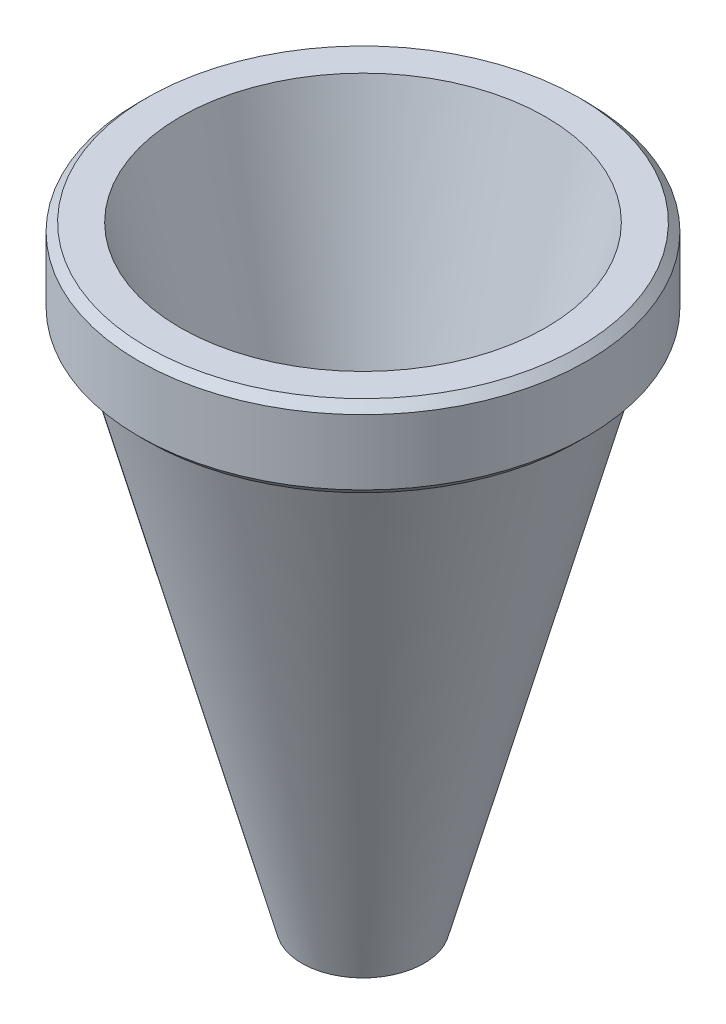
ISO-10303-21;
HEADER;
FILE_DESCRIPTION(('STEP AP214'),'2;1');
FILE_NAME('part.step','',(''),(''),'','','');
FILE_SCHEMA(('AUTOMOTIVE_DESIGN { 1 0 10303 214 1 1 1 1 }'));
ENDSEC;
DATA;
#1=APPLICATION_CONTEXT('core data for automotive mechanical design processes');
#2=APPLICATION_PROTOCOL_DEFINITION('international standard','automotive_design',2000,#1);
#3=PRODUCT_CONTEXT('',#1,'mechanical');
#4=PRODUCT('Part','Part','',(#3));
#5=PRODUCT_RELATED_PRODUCT_CATEGORY('part','',(#4));
#6=PRODUCT_DEFINITION_FORMATION('','',#4);
#7=PRODUCT_DEFINITION_CONTEXT('part definition',#1,'design');
#8=PRODUCT_DEFINITION('design','',#6,#7);
#9=PRODUCT_DEFINITION_SHAPE('','',#8);
#10=(LENGTH_UNIT() NAMED_UNIT(*) SI_UNIT(.MILLI.,.METRE.));
#11=(NAMED_UNIT(*) PLANE_ANGLE_UNIT() SI_UNIT($,.RADIAN.));
#12=(NAMED_UNIT(*) SI_UNIT($,.STERADIAN.) SOLID_ANGLE_UNIT());
#13=UNCERTAINTY_MEASURE_WITH_UNIT(LENGTH_MEASURE(1.E-05),#10,'distance_accuracy_value','');
#14=(GEOMETRIC_REPRESENTATION_CONTEXT(3) GLOBAL_UNCERTAINTY_ASSIGNED_CONTEXT((#13)) GLOBAL_UNIT_ASSIGNED_CONTEXT((#10,
#11,#12)) REPRESENTATION_CONTEXT('',''));
#15=CARTESIAN_POINT('',(0.,0.,0.));
#16=DIRECTION('',(0.,0.,1.));
#17=DIRECTION('',(1.,0.,0.));
#18=AXIS2_PLACEMENT_3D('',#15,#16,#17);
#19=CARTESIAN_POINT('',(0.,2.,0.));
#20=DIRECTION('',(0.,1.,0.));
#21=DIRECTION('',(1.,0.,0.));
#22=AXIS2_PLACEMENT_3D('',#19,#20,#21);
#23=PLANE('',#22);
#24=CARTESIAN_POINT('',(0.,2.,0.));
#25=DIRECTION('',(0.,-1.,0.));
#26=DIRECTION('',(1.,0.,0.));
#27=AXIS2_PLACEMENT_3D('',#24,#25,#26);
#28=CIRCLE('',#27,1.);
#29=CARTESIAN_POINT('',(-1.,2.,0.));
#30=VERTEX_POINT('',#29);
#31=EDGE_CURVE('E28',#30,#30,#28,.T.);
#32=ORIENTED_EDGE('',*,*,#31,.F.);
#33=EDGE_LOOP('',(#32));
#34=FACE_BOUND('',#33,.T.);
#35=ADVANCED_FACE('F17',(#34),#23,.T.);
#36=CARTESIAN_POINT('',(0.,8.5,0.));
#37=DIRECTION('',(0.,1.,0.));
#38=DIRECTION('',(1.,0.,0.));
#39=AXIS2_PLACEMENT_3D('',#36,#37,#38);
#40=CONICAL_SURFACE('',#39,2.741669750802,0.261799387799149);
#41=ORIENTED_EDGE('',*,*,#31,.T.);
#42=DIRECTION('',(-0.258819045102521,0.965925826289068,0.));
#43=VECTOR('',#42,1.);
#44=CARTESIAN_POINT('',(-2.741669750802,8.5,0.));
#45=LINE('',#44,#43);
#46=CARTESIAN_POINT('',(-4.483339501605,15.,0.));
#47=VERTEX_POINT('',#46);
#48=EDGE_CURVE('E11',#30,#47,#45,.T.);
#49=ORIENTED_EDGE('',*,*,#48,.T.);
#50=CARTESIAN_POINT('',(0.,15.,0.));
#51=DIRECTION('',(0.,1.,0.));
#52=DIRECTION('',(1.,0.,0.));
#53=AXIS2_PLACEMENT_3D('',#50,#51,#52);
#54=CIRCLE('',#53,4.483339501605);
#55=EDGE_CURVE('E87',#47,#47,#54,.T.);
#56=ORIENTED_EDGE('',*,*,#55,.T.);
#57=ORIENTED_EDGE('',*,*,#48,.F.);
#58=EDGE_LOOP('',(#41,#49,#56,#57));
#59=FACE_BOUND('',#58,.T.);
#60=ADVANCED_FACE('F157',(#59),#40,.F.);
#61=CARTESIAN_POINT('',(0.,15.,0.));
#62=DIRECTION('',(0.,1.,0.));
#63=DIRECTION('',(1.,0.,0.));
#64=AXIS2_PLACEMENT_3D('',#61,#62,#63);
#65=PLANE('',#64);
#66=ORIENTED_EDGE('',*,*,#55,.F.);
#67=EDGE_LOOP('',(#66));
#68=FACE_BOUND('',#67,.T.);
#69=CARTESIAN_POINT('',(0.,15.00000058203,0.));
#70=DIRECTION('',(0.,1.,0.));
#71=DIRECTION('',(1.,0.,0.));
#72=AXIS2_PLACEMENT_3D('',#69,#70,#71);
#73=CIRCLE('',#72,5.29999985448);
#74=CARTESIAN_POINT('',(0.,15.0000005820339,5.29999985448393));
#75=VERTEX_POINT('',#74);
#76=EDGE_CURVE('E83',#75,#75,#73,.T.);
#77=ORIENTED_EDGE('',*,*,#76,.T.);
#78=EDGE_LOOP('',(#77));
#79=FACE_BOUND('',#78,.T.);
#80=ADVANCED_FACE('F84',(#68,#79),#65,.T.);
#81=CARTESIAN_POINT('',(0.,14.90000010319,0.));
#82=DIRECTION('',(0.,-1.,0.));
#83=DIRECTION('',(0.,0.,-1.));
#84=AXIS2_PLACEMENT_3D('',#81,#82,#83);
#85=CONICAL_SURFACE('',#84,5.400000341564,0.785398204577968);
#86=CARTESIAN_POINT('',(0.,14.79999923756,0.));
#87=DIRECTION('',(0.,1.,0.));
#88=DIRECTION('',(1.,0.,0.));
#89=AXIS2_PLACEMENT_3D('',#86,#87,#88);
#90=CIRCLE('',#89,5.5);
#91=CARTESIAN_POINT('',(-5.5,14.79999923756,0.));
#92=VERTEX_POINT('',#91);
#93=CARTESIAN_POINT('',(0.,14.7999998452751,5.50000060771505));
#94=VERTEX_POINT('',#93);
#95=EDGE_CURVE('E102',#92,#94,#90,.T.);
#96=ORIENTED_EDGE('',*,*,#95,.T.);
#97=DIRECTION('',(0.,0.707106752067522,-0.707106810305572));
#98=VECTOR('',#97,1.);
#99=CARTESIAN_POINT('',(0.,14.90000010319,5.400000341564));
#100=LINE('',#99,#98);
#101=EDGE_CURVE('E88',#94,#75,#100,.T.);
#102=ORIENTED_EDGE('',*,*,#101,.T.);
#103=ORIENTED_EDGE('',*,*,#76,.F.);
#104=ORIENTED_EDGE('',*,*,#101,.F.);
#105=CARTESIAN_POINT('',(0.,14.79999923756,0.));
#106=DIRECTION('',(0.,1.,0.));
#107=DIRECTION('',(1.,0.,0.));
#108=AXIS2_PLACEMENT_3D('',#105,#106,#107);
#109=CIRCLE('',#108,5.5);
#110=EDGE_CURVE('E52',#94,#92,#109,.T.);
#111=ORIENTED_EDGE('',*,*,#110,.T.);
#112=EDGE_LOOP('',(#96,#102,#103,#104,#111));
#113=FACE_BOUND('',#112,.T.);
#114=ADVANCED_FACE('F119',(#113),#85,.T.);
#115=CARTESIAN_POINT('',(0.,-0.75,0.));
#116=DIRECTION('',(0.,1.,0.));
#117=DIRECTION('',(1.,0.,0.));
#118=AXIS2_PLACEMENT_3D('',#115,#116,#117);
#119=CYLINDRICAL_SURFACE('',#118,5.5);
#120=ORIENTED_EDGE('',*,*,#95,.F.);
#121=DIRECTION('',(0.,-1.,0.));
#122=VECTOR('',#121,1.);
#123=CARTESIAN_POINT('',(-5.5,-0.75,0.));
#124=LINE('',#123,#122);
#125=CARTESIAN_POINT('',(-5.5,13.20000061936,0.));
#126=VERTEX_POINT('',#125);
#127=EDGE_CURVE('E99',#92,#126,#124,.T.);
#128=ORIENTED_EDGE('',*,*,#127,.T.);
#129=CARTESIAN_POINT('',(0.,13.20000061936,0.));
#130=DIRECTION('',(0.,1.,0.));
#131=DIRECTION('',(1.,0.,0.));
#132=AXIS2_PLACEMENT_3D('',#129,#130,#131);
#133=CIRCLE('',#132,5.5);
#134=CARTESIAN_POINT('',(0.,13.2000000005091,5.5000006188508));
#135=VERTEX_POINT('',#134);
#136=EDGE_CURVE('E109',#126,#135,#133,.T.);
#137=ORIENTED_EDGE('',*,*,#136,.T.);
#138=CARTESIAN_POINT('',(0.,13.20000061936,0.));
#139=DIRECTION('',(0.,1.,0.));
#140=DIRECTION('',(1.,0.,0.));
#141=AXIS2_PLACEMENT_3D('',#138,#139,#140);
#142=CIRCLE('',#141,5.5);
#143=EDGE_CURVE('E105',#135,#126,#142,.T.);
#144=ORIENTED_EDGE('',*,*,#143,.T.);
#145=ORIENTED_EDGE('',*,*,#127,.F.);
#146=ORIENTED_EDGE('',*,*,#110,.F.);
#147=EDGE_LOOP('',(#120,#128,#137,#144,#145,#146));
#148=FACE_BOUND('',#147,.T.);
#149=ADVANCED_FACE('F121',(#148),#119,.T.);
#150=CARTESIAN_POINT('',(0.,13.09999978553,0.));
#151=DIRECTION('',(0.,1.,0.));
#152=DIRECTION('',(0.,0.,-1.));
#153=AXIS2_PLACEMENT_3D('',#150,#151,#152);
#154=CONICAL_SURFACE('',#153,5.400000392629,0.785398219610664);
#155=ORIENTED_EDGE('',*,*,#136,.F.);
#156=ORIENTED_EDGE('',*,*,#143,.F.);
#157=DIRECTION('',(0.,-0.707106741437801,-0.707106820935292));
#158=VECTOR('',#157,1.);
#159=CARTESIAN_POINT('',(0.,13.09999978553,5.400000392629));
#160=LINE('',#159,#158);
#161=CARTESIAN_POINT('',(0.,12.9999994065833,5.30000000243966));
#162=VERTEX_POINT('',#161);
#163=EDGE_CURVE('E65',#135,#162,#160,.T.);
#164=ORIENTED_EDGE('',*,*,#163,.T.);
#165=CARTESIAN_POINT('',(0.,12.99999940658,0.));
#166=DIRECTION('',(0.,1.,0.));
#167=DIRECTION('',(1.,0.,0.));
#168=AXIS2_PLACEMENT_3D('',#165,#166,#167);
#169=CIRCLE('',#168,5.300000002443);
#170=EDGE_CURVE('E127',#162,#162,#169,.T.);
#171=ORIENTED_EDGE('',*,*,#170,.T.);
#172=ORIENTED_EDGE('',*,*,#163,.F.);
#173=EDGE_LOOP('',(#155,#156,#164,#171,#172));
#174=FACE_BOUND('',#173,.T.);
#175=ADVANCED_FACE('F138',(#174),#154,.T.);
#176=CARTESIAN_POINT('',(0.,13.,0.));
#177=DIRECTION('',(0.,1.,0.));
#178=DIRECTION('',(1.,0.,0.));
#179=AXIS2_PLACEMENT_3D('',#176,#177,#178);
#180=PLANE('',#179);
#181=CARTESIAN_POINT('',(0.,13.,0.));
#182=DIRECTION('',(0.,-1.,0.));
#183=DIRECTION('',(1.,0.,0.));
#184=AXIS2_PLACEMENT_3D('',#181,#182,#183);
#185=CIRCLE('',#184,4.983339501605);
#186=CARTESIAN_POINT('',(-4.983339501605,13.,0.));
#187=VERTEX_POINT('',#186);
#188=EDGE_CURVE('E110',#187,#187,#185,.T.);
#189=ORIENTED_EDGE('',*,*,#188,.F.);
#190=EDGE_LOOP('',(#189));
#191=FACE_BOUND('',#190,.T.);
#192=ORIENTED_EDGE('',*,*,#170,.F.);
#193=EDGE_LOOP('',(#192));
#194=FACE_BOUND('',#193,.T.);
#195=ADVANCED_FACE('F141',(#191,#194),#180,.F.);
#196=CARTESIAN_POINT('',(0.,6.5,0.));
#197=DIRECTION('',(0.,1.,0.));
#198=DIRECTION('',(1.,0.,0.));
#199=AXIS2_PLACEMENT_3D('',#196,#197,#198);
#200=CONICAL_SURFACE('',#199,3.241669750802,0.261799387799149);
#201=ORIENTED_EDGE('',*,*,#188,.T.);
#202=DIRECTION('',(0.258819045102521,-0.965925826289068,0.));
#203=VECTOR('',#202,1.);
#204=CARTESIAN_POINT('',(-3.241669750802,6.5,0.));
#205=LINE('',#204,#203);
#206=CARTESIAN_POINT('',(-1.5,0.,0.));
#207=VERTEX_POINT('',#206);
#208=EDGE_CURVE('E21',#187,#207,#205,.T.);
#209=ORIENTED_EDGE('',*,*,#208,.T.);
#210=CARTESIAN_POINT('',(0.,0.,0.));
#211=DIRECTION('',(0.,-1.,0.));
#212=DIRECTION('',(1.,0.,0.));
#213=AXIS2_PLACEMENT_3D('',#210,#211,#212);
#214=CIRCLE('',#213,1.5);
#215=EDGE_CURVE('E114',#207,#207,#214,.T.);
#216=ORIENTED_EDGE('',*,*,#215,.F.);
#217=ORIENTED_EDGE('',*,*,#208,.F.);
#218=EDGE_LOOP('',(#201,#209,#216,#217));
#219=FACE_BOUND('',#218,.T.);
#220=ADVANCED_FACE('F19',(#219),#200,.T.);
#221=CARTESIAN_POINT('',(0.,0.,0.));
#222=DIRECTION('',(0.,1.,0.));
#223=DIRECTION('',(1.,0.,0.));
#224=AXIS2_PLACEMENT_3D('',#221,#222,#223);
#225=PLANE('',#224);
#226=ORIENTED_EDGE('',*,*,#215,.T.);
#227=EDGE_LOOP('',(#226));
#228=FACE_BOUND('',#227,.T.);
#229=ADVANCED_FACE('F150',(#228),#225,.F.);
#230=CLOSED_SHELL('',(#35,#60,#80,#114,#149,#175,#195,#220,#229));
#231=MANIFOLD_SOLID_BREP('B1',#230);
#232=ADVANCED_BREP_SHAPE_REPRESENTATION('',(#18,#231),#14);
#233=SHAPE_DEFINITION_REPRESENTATION(#9,#232);
ENDSEC;
END-ISO-10303-21;
